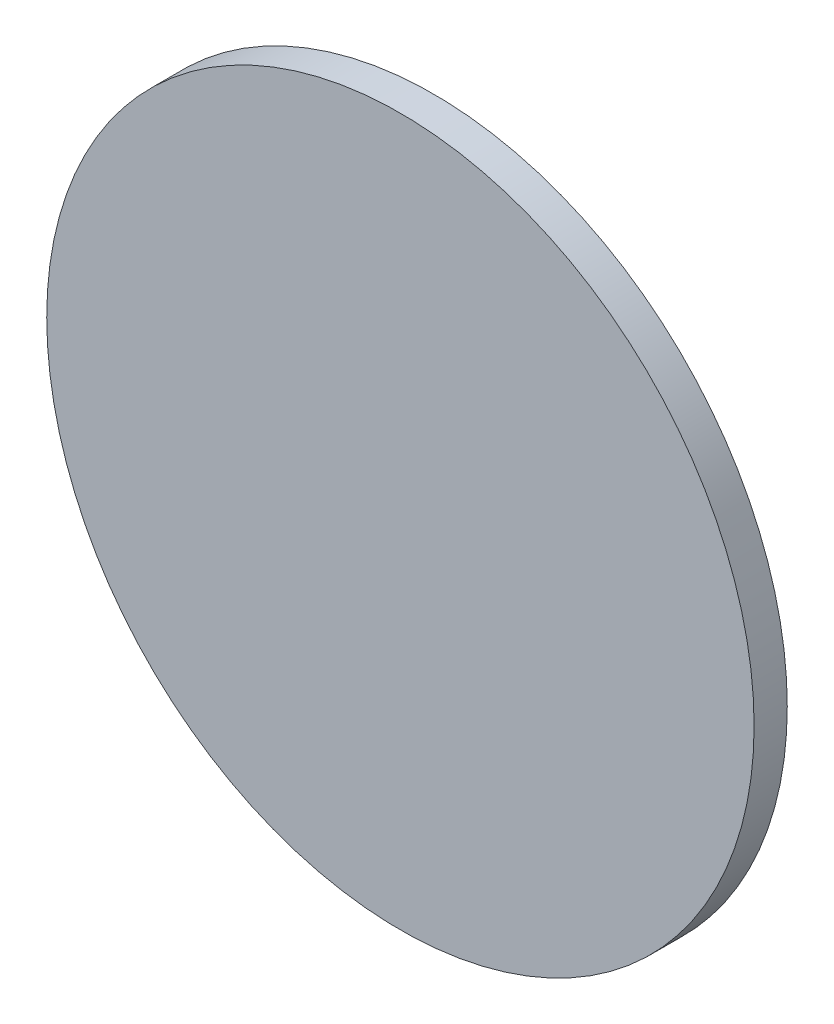
ISO-10303-21;
HEADER;
FILE_DESCRIPTION(('STEP AP214'),'2;1');
FILE_NAME('part.step','',(''),(''),'','','');
FILE_SCHEMA(('AUTOMOTIVE_DESIGN { 1 0 10303 214 1 1 1 1 }'));
ENDSEC;
DATA;
#1=APPLICATION_CONTEXT('core data for automotive mechanical design processes');
#2=APPLICATION_PROTOCOL_DEFINITION('international standard','automotive_design',2000,#1);
#3=PRODUCT_CONTEXT('',#1,'mechanical');
#4=PRODUCT('Part','Part','',(#3));
#5=PRODUCT_RELATED_PRODUCT_CATEGORY('part','',(#4));
#6=PRODUCT_DEFINITION_FORMATION('','',#4);
#7=PRODUCT_DEFINITION_CONTEXT('part definition',#1,'design');
#8=PRODUCT_DEFINITION('design','',#6,#7);
#9=PRODUCT_DEFINITION_SHAPE('','',#8);
#10=(LENGTH_UNIT() NAMED_UNIT(*) SI_UNIT(.MILLI.,.METRE.));
#11=(NAMED_UNIT(*) PLANE_ANGLE_UNIT() SI_UNIT($,.RADIAN.));
#12=(NAMED_UNIT(*) SI_UNIT($,.STERADIAN.) SOLID_ANGLE_UNIT());
#13=UNCERTAINTY_MEASURE_WITH_UNIT(LENGTH_MEASURE(1.E-05),#10,'distance_accuracy_value','');
#14=(GEOMETRIC_REPRESENTATION_CONTEXT(3) GLOBAL_UNCERTAINTY_ASSIGNED_CONTEXT((#13)) GLOBAL_UNIT_ASSIGNED_CONTEXT((#10,
#11,#12)) REPRESENTATION_CONTEXT('',''));
#15=CARTESIAN_POINT('',(0.,0.,0.));
#16=DIRECTION('',(0.,0.,1.));
#17=DIRECTION('',(1.,0.,0.));
#18=AXIS2_PLACEMENT_3D('',#15,#16,#17);
#19=CARTESIAN_POINT('',(0.,0.,19.05));
#20=DIRECTION('',(0.,0.,-1.));
#21=DIRECTION('',(-1.,0.,0.));
#22=AXIS2_PLACEMENT_3D('',#19,#20,#21);
#23=CYLINDRICAL_SURFACE('',#22,203.2);
#24=CARTESIAN_POINT('',(0.,0.,19.05));
#25=DIRECTION('',(0.,0.,1.));
#26=DIRECTION('',(1.,0.,0.));
#27=AXIS2_PLACEMENT_3D('',#24,#25,#26);
#28=CIRCLE('',#27,203.2);
#29=CARTESIAN_POINT('',(-203.2,0.,19.05));
#30=VERTEX_POINT('',#29);
#31=EDGE_CURVE('E10',#30,#30,#28,.T.);
#32=CARTESIAN_POINT('',(0.,0.,0.));
#33=DIRECTION('',(0.,0.,1.));
#34=DIRECTION('',(1.,0.,0.));
#35=AXIS2_PLACEMENT_3D('',#32,#33,#34);
#36=CIRCLE('',#35,203.2);
#37=CARTESIAN_POINT('',(-203.2,0.,0.));
#38=VERTEX_POINT('',#37);
#39=EDGE_CURVE('E40',#38,#38,#36,.T.);
#40=CARTESIAN_POINT('',(-203.2,0.,19.05));
#41=CARTESIAN_POINT('',(-203.2,0.,18.8515625));
#42=CARTESIAN_POINT('',(-203.2,0.,18.653125));
#43=CARTESIAN_POINT('',(-203.2,0.,18.25625));
#44=CARTESIAN_POINT('',(-203.2,0.,18.0578125));
#45=CARTESIAN_POINT('',(-203.2,0.,17.6609375));
#46=CARTESIAN_POINT('',(-203.2,0.,17.4625));
#47=CARTESIAN_POINT('',(-203.2,0.,17.065625));
#48=CARTESIAN_POINT('',(-203.2,0.,16.8671875));
#49=CARTESIAN_POINT('',(-203.2,0.,16.4703125));
#50=CARTESIAN_POINT('',(-203.2,0.,16.271875));
#51=CARTESIAN_POINT('',(-203.2,0.,15.875));
#52=CARTESIAN_POINT('',(-203.2,0.,15.6765625));
#53=CARTESIAN_POINT('',(-203.2,0.,15.2796875));
#54=CARTESIAN_POINT('',(-203.2,0.,15.08125));
#55=CARTESIAN_POINT('',(-203.2,0.,14.684375));
#56=CARTESIAN_POINT('',(-203.2,0.,14.4859375));
#57=CARTESIAN_POINT('',(-203.2,0.,14.0890625));
#58=CARTESIAN_POINT('',(-203.2,0.,13.890625));
#59=CARTESIAN_POINT('',(-203.2,0.,13.49375));
#60=CARTESIAN_POINT('',(-203.2,0.,13.2953125));
#61=CARTESIAN_POINT('',(-203.2,0.,12.8984375));
#62=CARTESIAN_POINT('',(-203.2,0.,12.7));
#63=CARTESIAN_POINT('',(-203.2,0.,12.303125));
#64=CARTESIAN_POINT('',(-203.2,0.,12.1046875));
#65=CARTESIAN_POINT('',(-203.2,0.,11.7078125));
#66=CARTESIAN_POINT('',(-203.2,0.,11.509375));
#67=CARTESIAN_POINT('',(-203.2,0.,11.1125));
#68=CARTESIAN_POINT('',(-203.2,0.,10.9140625));
#69=CARTESIAN_POINT('',(-203.2,0.,10.5171875));
#70=CARTESIAN_POINT('',(-203.2,0.,10.31875));
#71=CARTESIAN_POINT('',(-203.2,0.,9.921875));
#72=CARTESIAN_POINT('',(-203.2,0.,9.7234375));
#73=CARTESIAN_POINT('',(-203.2,0.,9.3265625));
#74=CARTESIAN_POINT('',(-203.2,0.,9.128125));
#75=CARTESIAN_POINT('',(-203.2,0.,8.73125));
#76=CARTESIAN_POINT('',(-203.2,0.,8.5328125));
#77=CARTESIAN_POINT('',(-203.2,0.,8.1359375));
#78=CARTESIAN_POINT('',(-203.2,0.,7.9375));
#79=CARTESIAN_POINT('',(-203.2,0.,7.540625));
#80=CARTESIAN_POINT('',(-203.2,0.,7.3421875));
#81=CARTESIAN_POINT('',(-203.2,0.,6.9453125));
#82=CARTESIAN_POINT('',(-203.2,0.,6.746875));
#83=CARTESIAN_POINT('',(-203.2,0.,6.35));
#84=CARTESIAN_POINT('',(-203.2,0.,6.1515625));
#85=CARTESIAN_POINT('',(-203.2,0.,5.7546875));
#86=CARTESIAN_POINT('',(-203.2,0.,5.55625));
#87=CARTESIAN_POINT('',(-203.2,0.,5.159375));
#88=CARTESIAN_POINT('',(-203.2,0.,4.9609375));
#89=CARTESIAN_POINT('',(-203.2,0.,4.5640625));
#90=CARTESIAN_POINT('',(-203.2,0.,4.365625));
#91=CARTESIAN_POINT('',(-203.2,0.,3.96875));
#92=CARTESIAN_POINT('',(-203.2,0.,3.7703125));
#93=CARTESIAN_POINT('',(-203.2,0.,3.3734375));
#94=CARTESIAN_POINT('',(-203.2,0.,3.175));
#95=CARTESIAN_POINT('',(-203.2,0.,2.778125));
#96=CARTESIAN_POINT('',(-203.2,0.,2.5796875));
#97=CARTESIAN_POINT('',(-203.2,0.,2.1828125));
#98=CARTESIAN_POINT('',(-203.2,0.,1.984375));
#99=CARTESIAN_POINT('',(-203.2,0.,1.5875));
#100=CARTESIAN_POINT('',(-203.2,0.,1.3890625));
#101=CARTESIAN_POINT('',(-203.2,0.,0.992187500000001));
#102=CARTESIAN_POINT('',(-203.2,0.,0.793750000000001));
#103=CARTESIAN_POINT('',(-203.2,0.,0.396875));
#104=CARTESIAN_POINT('',(-203.2,0.,0.1984375));
#105=CARTESIAN_POINT('',(-203.2,0.,0.));
#106=B_SPLINE_CURVE_WITH_KNOTS('',3,(#40,#41,#42,#43,#44,#45,#46,#47,#48,#49,#50,#51,#52,#53,
#54,#55,#56,#57,#58,#59,#60,#61,#62,#63,#64,#65,#66,#67,#68,#69,#70,#71,#72,#73,#74,#75,#76,#77,
#78,#79,#80,#81,#82,#83,#84,#85,#86,#87,#88,#89,#90,#91,#92,#93,#94,#95,#96,#97,#98,#99,#100,
#101,#102,#103,#104,#105),.UNSPECIFIED.,.F.,.F.,(4,2,2,2,2,2,2,2,2,2,2,2,2,2,2,2,2,2,2,2,2,2,2,
2,2,2,2,2,2,2,2,2,4),(0.,0.595312499999997,1.190625,1.7859375,2.38125,2.9765625,3.571875,
4.1671875,4.7625,5.3578125,5.953125,6.5484375,7.14375,7.7390625,8.334375,8.9296875,9.525,
10.1203125,10.715625,11.3109375,11.90625,12.5015625,13.096875,13.6921875,14.2875,14.8828125,
15.478125,16.0734375,16.66875,17.2640625,17.859375,18.4546875,19.05),.UNSPECIFIED.);
#107=EDGE_CURVE('BSEAM37',#30,#38,#106,.T.);
#108=ORIENTED_EDGE('',*,*,#31,.F.);
#109=ORIENTED_EDGE('',*,*,#39,.T.);
#110=ORIENTED_EDGE('',*,*,#107,.T.);
#111=ORIENTED_EDGE('',*,*,#107,.F.);
#112=EDGE_LOOP('',(#108,#110,#109,#111));
#113=FACE_BOUND('',#112,.T.);
#114=ADVANCED_FACE('F37',(#113),#23,.T.);
#115=CARTESIAN_POINT('',(0.,0.,19.05));
#116=DIRECTION('',(0.,0.,1.));
#117=DIRECTION('',(1.,0.,0.));
#118=AXIS2_PLACEMENT_3D('',#115,#116,#117);
#119=PLANE('',#118);
#120=ORIENTED_EDGE('',*,*,#31,.T.);
#121=EDGE_LOOP('',(#120));
#122=FACE_BOUND('',#121,.T.);
#123=ADVANCED_FACE('F54',(#122),#119,.T.);
#124=CARTESIAN_POINT('',(0.,0.,0.));
#125=DIRECTION('',(0.,0.,1.));
#126=DIRECTION('',(1.,0.,0.));
#127=AXIS2_PLACEMENT_3D('',#124,#125,#126);
#128=PLANE('',#127);
#129=ORIENTED_EDGE('',*,*,#39,.F.);
#130=EDGE_LOOP('',(#129));
#131=FACE_BOUND('',#130,.T.);
#132=ADVANCED_FACE('F52',(#131),#128,.F.);
#133=CLOSED_SHELL('',(#114,#123,#132));
#134=MANIFOLD_SOLID_BREP('B2',#133);
#135=ADVANCED_BREP_SHAPE_REPRESENTATION('',(#18,#134),#14);
#136=SHAPE_DEFINITION_REPRESENTATION(#9,#135);
ENDSEC;
END-ISO-10303-21;
